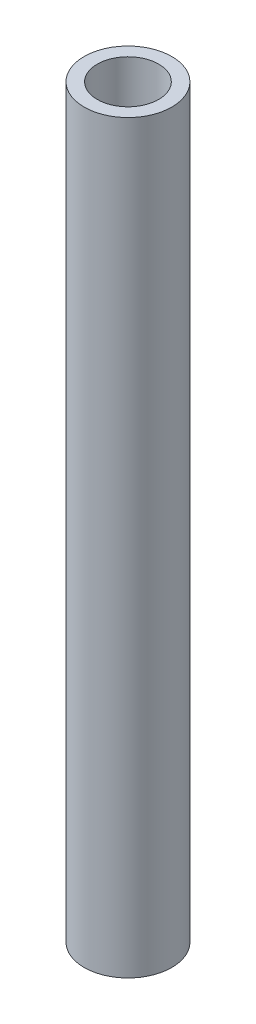
ISO-10303-21;
HEADER;
FILE_DESCRIPTION(('STEP AP214'),'2;1');
FILE_NAME('part.step','',(''),(''),'','','');
FILE_SCHEMA(('AUTOMOTIVE_DESIGN { 1 0 10303 214 1 1 1 1 }'));
ENDSEC;
DATA;
#1=APPLICATION_CONTEXT('core data for automotive mechanical design processes');
#2=APPLICATION_PROTOCOL_DEFINITION('international standard','automotive_design',2000,#1);
#3=PRODUCT_CONTEXT('',#1,'mechanical');
#4=PRODUCT('Part','Part','',(#3));
#5=PRODUCT_RELATED_PRODUCT_CATEGORY('part','',(#4));
#6=PRODUCT_DEFINITION_FORMATION('','',#4);
#7=PRODUCT_DEFINITION_CONTEXT('part definition',#1,'design');
#8=PRODUCT_DEFINITION('design','',#6,#7);
#9=PRODUCT_DEFINITION_SHAPE('','',#8);
#10=(LENGTH_UNIT() NAMED_UNIT(*) SI_UNIT(.MILLI.,.METRE.));
#11=(NAMED_UNIT(*) PLANE_ANGLE_UNIT() SI_UNIT($,.RADIAN.));
#12=(NAMED_UNIT(*) SI_UNIT($,.STERADIAN.) SOLID_ANGLE_UNIT());
#13=UNCERTAINTY_MEASURE_WITH_UNIT(LENGTH_MEASURE(1.E-05),#10,'distance_accuracy_value','');
#14=(GEOMETRIC_REPRESENTATION_CONTEXT(3) GLOBAL_UNCERTAINTY_ASSIGNED_CONTEXT((#13)) GLOBAL_UNIT_ASSIGNED_CONTEXT((#10,
#11,#12)) REPRESENTATION_CONTEXT('',''));
#15=CARTESIAN_POINT('',(0.,0.,0.));
#16=DIRECTION('',(0.,0.,1.));
#17=DIRECTION('',(1.,0.,0.));
#18=AXIS2_PLACEMENT_3D('',#15,#16,#17);
#19=CARTESIAN_POINT('',(0.,85.,0.));
#20=DIRECTION('',(0.,1.,0.));
#21=DIRECTION('',(0.,0.,1.));
#22=AXIS2_PLACEMENT_3D('',#19,#20,#21);
#23=PLANE('',#22);
#24=CARTESIAN_POINT('',(0.,85.,0.));
#25=DIRECTION('',(0.,1.,0.));
#26=DIRECTION('',(0.,0.,1.));
#27=AXIS2_PLACEMENT_3D('',#24,#25,#26);
#28=CIRCLE('',#27,5.);
#29=CARTESIAN_POINT('',(0.,85.,5.));
#30=VERTEX_POINT('',#29);
#31=EDGE_CURVE('E10',#30,#30,#28,.T.);
#32=ORIENTED_EDGE('',*,*,#31,.T.);
#33=EDGE_LOOP('',(#32));
#34=FACE_BOUND('',#33,.T.);
#35=CARTESIAN_POINT('',(0.,85.,0.));
#36=DIRECTION('',(0.,1.,0.));
#37=DIRECTION('',(0.,0.,1.));
#38=AXIS2_PLACEMENT_3D('',#35,#36,#37);
#39=CIRCLE('',#38,3.5);
#40=CARTESIAN_POINT('',(0.,85.,3.5));
#41=VERTEX_POINT('',#40);
#42=EDGE_CURVE('E48',#41,#41,#39,.T.);
#43=ORIENTED_EDGE('',*,*,#42,.F.);
#44=EDGE_LOOP('',(#43));
#45=FACE_BOUND('',#44,.T.);
#46=ADVANCED_FACE('F37',(#34,#45),#23,.T.);
#47=CARTESIAN_POINT('',(0.,0.,0.));
#48=DIRECTION('',(0.,1.,0.));
#49=DIRECTION('',(0.,0.,1.));
#50=AXIS2_PLACEMENT_3D('',#47,#48,#49);
#51=PLANE('',#50);
#52=CARTESIAN_POINT('',(0.,0.,0.));
#53=DIRECTION('',(0.,1.,0.));
#54=DIRECTION('',(0.,0.,1.));
#55=AXIS2_PLACEMENT_3D('',#52,#53,#54);
#56=CIRCLE('',#55,5.);
#57=CARTESIAN_POINT('',(0.,0.,5.));
#58=VERTEX_POINT('',#57);
#59=EDGE_CURVE('E41',#58,#58,#56,.T.);
#60=ORIENTED_EDGE('',*,*,#59,.F.);
#61=EDGE_LOOP('',(#60));
#62=FACE_BOUND('',#61,.T.);
#63=CARTESIAN_POINT('',(0.,0.,0.));
#64=DIRECTION('',(0.,1.,0.));
#65=DIRECTION('',(0.,0.,1.));
#66=AXIS2_PLACEMENT_3D('',#63,#64,#65);
#67=CIRCLE('',#66,3.5);
#68=CARTESIAN_POINT('',(0.,0.,3.5));
#69=VERTEX_POINT('',#68);
#70=EDGE_CURVE('E50',#69,#69,#67,.T.);
#71=ORIENTED_EDGE('',*,*,#70,.T.);
#72=EDGE_LOOP('',(#71));
#73=FACE_BOUND('',#72,.T.);
#74=ADVANCED_FACE('F60',(#62,#73),#51,.F.);
#75=CARTESIAN_POINT('',(0.,85.,0.));
#76=DIRECTION('',(0.,-1.,0.));
#77=DIRECTION('',(0.,0.,-1.));
#78=AXIS2_PLACEMENT_3D('',#75,#76,#77);
#79=CYLINDRICAL_SURFACE('',#78,5.);
#80=ORIENTED_EDGE('',*,*,#31,.F.);
#81=EDGE_LOOP('',(#80));
#82=FACE_BOUND('',#81,.T.);
#83=ORIENTED_EDGE('',*,*,#59,.T.);
#84=EDGE_LOOP('',(#83));
#85=FACE_BOUND('',#84,.T.);
#86=ADVANCED_FACE('F39',(#82,#85),#79,.T.);
#87=CARTESIAN_POINT('',(0.,85.,0.));
#88=DIRECTION('',(0.,-1.,0.));
#89=DIRECTION('',(0.,0.,-1.));
#90=AXIS2_PLACEMENT_3D('',#87,#88,#89);
#91=CYLINDRICAL_SURFACE('',#90,3.5);
#92=ORIENTED_EDGE('',*,*,#42,.T.);
#93=EDGE_LOOP('',(#92));
#94=FACE_BOUND('',#93,.T.);
#95=ORIENTED_EDGE('',*,*,#70,.F.);
#96=EDGE_LOOP('',(#95));
#97=FACE_BOUND('',#96,.T.);
#98=ADVANCED_FACE('F56',(#94,#97),#91,.F.);
#99=CLOSED_SHELL('',(#46,#74,#86,#98));
#100=MANIFOLD_SOLID_BREP('B2',#99);
#101=ADVANCED_BREP_SHAPE_REPRESENTATION('',(#18,#100),#14);
#102=SHAPE_DEFINITION_REPRESENTATION(#9,#101);
ENDSEC;
END-ISO-10303-21;
